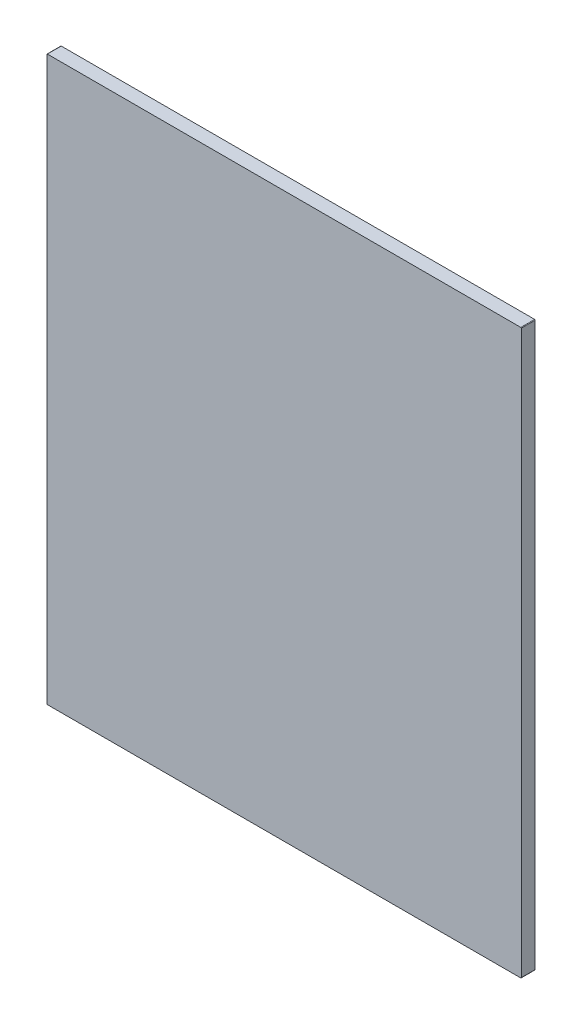
ISO-10303-21;
HEADER;
FILE_DESCRIPTION(('STEP AP214'),'2;1');
FILE_NAME('part.step','',(''),(''),'','','');
FILE_SCHEMA(('AUTOMOTIVE_DESIGN { 1 0 10303 214 1 1 1 1 }'));
ENDSEC;
DATA;
#1=APPLICATION_CONTEXT('core data for automotive mechanical design processes');
#2=APPLICATION_PROTOCOL_DEFINITION('international standard','automotive_design',2000,#1);
#3=PRODUCT_CONTEXT('',#1,'mechanical');
#4=PRODUCT('Part','Part','',(#3));
#5=PRODUCT_RELATED_PRODUCT_CATEGORY('part','',(#4));
#6=PRODUCT_DEFINITION_FORMATION('','',#4);
#7=PRODUCT_DEFINITION_CONTEXT('part definition',#1,'design');
#8=PRODUCT_DEFINITION('design','',#6,#7);
#9=PRODUCT_DEFINITION_SHAPE('','',#8);
#10=(LENGTH_UNIT() NAMED_UNIT(*) SI_UNIT(.MILLI.,.METRE.));
#11=(NAMED_UNIT(*) PLANE_ANGLE_UNIT() SI_UNIT($,.RADIAN.));
#12=(NAMED_UNIT(*) SI_UNIT($,.STERADIAN.) SOLID_ANGLE_UNIT());
#13=UNCERTAINTY_MEASURE_WITH_UNIT(LENGTH_MEASURE(1.E-05),#10,'distance_accuracy_value','');
#14=(GEOMETRIC_REPRESENTATION_CONTEXT(3) GLOBAL_UNCERTAINTY_ASSIGNED_CONTEXT((#13)) GLOBAL_UNIT_ASSIGNED_CONTEXT((#10,
#11,#12)) REPRESENTATION_CONTEXT('',''));
#15=CARTESIAN_POINT('',(0.,0.,0.));
#16=DIRECTION('',(0.,0.,1.));
#17=DIRECTION('',(1.,0.,0.));
#18=AXIS2_PLACEMENT_3D('',#15,#16,#17);
#19=CARTESIAN_POINT('',(0.,0.,6.35));
#20=DIRECTION('',(1.,0.,0.));
#21=DIRECTION('',(0.,0.,-1.));
#22=AXIS2_PLACEMENT_3D('',#19,#20,#21);
#23=PLANE('',#22);
#24=DIRECTION('',(0.,-1.,0.));
#25=VECTOR('',#24,1.);
#26=CARTESIAN_POINT('',(0.,0.,0.));
#27=LINE('',#26,#25);
#28=CARTESIAN_POINT('',(0.,257.683,0.));
#29=VERTEX_POINT('',#28);
#30=CARTESIAN_POINT('',(0.,0.254,0.));
#31=VERTEX_POINT('',#30);
#32=EDGE_CURVE('E144',#29,#31,#27,.T.);
#33=ORIENTED_EDGE('',*,*,#32,.T.);
#34=DIRECTION('',(0.,0.,-1.));
#35=VECTOR('',#34,1.);
#36=CARTESIAN_POINT('',(0.,0.254,6.35));
#37=LINE('',#36,#35);
#38=CARTESIAN_POINT('',(0.,0.254,6.35));
#39=VERTEX_POINT('',#38);
#40=EDGE_CURVE('E178',#31,#39,#37,.F.);
#41=ORIENTED_EDGE('',*,*,#40,.T.);
#42=DIRECTION('',(0.,-1.,0.));
#43=VECTOR('',#42,1.);
#44=CARTESIAN_POINT('',(0.,0.,6.35));
#45=LINE('',#44,#43);
#46=CARTESIAN_POINT('',(0.,257.683,6.35));
#47=VERTEX_POINT('',#46);
#48=EDGE_CURVE('E142',#47,#39,#45,.T.);
#49=ORIENTED_EDGE('',*,*,#48,.F.);
#50=DIRECTION('',(0.,0.,-1.));
#51=VECTOR('',#50,1.);
#52=CARTESIAN_POINT('',(0.,257.683,6.35));
#53=LINE('',#52,#51);
#54=EDGE_CURVE('E174',#47,#29,#53,.T.);
#55=ORIENTED_EDGE('',*,*,#54,.T.);
#56=EDGE_LOOP('',(#33,#41,#49,#55));
#57=FACE_BOUND('',#56,.T.);
#58=ADVANCED_FACE('F42',(#57),#23,.F.);
#59=CARTESIAN_POINT('',(0.,0.,6.35));
#60=DIRECTION('',(0.,1.,0.));
#61=DIRECTION('',(0.,0.,1.));
#62=AXIS2_PLACEMENT_3D('',#59,#60,#61);
#63=PLANE('',#62);
#64=DIRECTION('',(1.,0.,0.));
#65=VECTOR('',#64,1.);
#66=CARTESIAN_POINT('',(0.,0.,0.));
#67=LINE('',#66,#65);
#68=CARTESIAN_POINT('',(0.254,0.,0.));
#69=VERTEX_POINT('',#68);
#70=CARTESIAN_POINT('',(216.916,0.,0.));
#71=VERTEX_POINT('',#70);
#72=EDGE_CURVE('E137',#69,#71,#67,.T.);
#73=ORIENTED_EDGE('',*,*,#72,.T.);
#74=DIRECTION('',(0.,0.,-1.));
#75=VECTOR('',#74,1.);
#76=CARTESIAN_POINT('',(216.916,0.,6.35));
#77=LINE('',#76,#75);
#78=CARTESIAN_POINT('',(216.916,0.,6.35));
#79=VERTEX_POINT('',#78);
#80=EDGE_CURVE('E113',#71,#79,#77,.F.);
#81=ORIENTED_EDGE('',*,*,#80,.T.);
#82=DIRECTION('',(1.,0.,0.));
#83=VECTOR('',#82,1.);
#84=CARTESIAN_POINT('',(0.,0.,6.35));
#85=LINE('',#84,#83);
#86=CARTESIAN_POINT('',(0.254,0.,6.35));
#87=VERTEX_POINT('',#86);
#88=EDGE_CURVE('E198',#87,#79,#85,.T.);
#89=ORIENTED_EDGE('',*,*,#88,.F.);
#90=DIRECTION('',(0.,0.,-1.));
#91=VECTOR('',#90,1.);
#92=CARTESIAN_POINT('',(0.254,0.,6.35));
#93=LINE('',#92,#91);
#94=EDGE_CURVE('E119',#87,#69,#93,.T.);
#95=ORIENTED_EDGE('',*,*,#94,.T.);
#96=EDGE_LOOP('',(#73,#81,#89,#95));
#97=FACE_BOUND('',#96,.T.);
#98=ADVANCED_FACE('F223',(#97),#63,.F.);
#99=CARTESIAN_POINT('',(217.17,0.,6.35));
#100=DIRECTION('',(-1.,0.,0.));
#101=DIRECTION('',(0.,0.,1.));
#102=AXIS2_PLACEMENT_3D('',#99,#100,#101);
#103=PLANE('',#102);
#104=DIRECTION('',(0.,1.,0.));
#105=VECTOR('',#104,1.);
#106=CARTESIAN_POINT('',(217.17,0.,6.35));
#107=LINE('',#106,#105);
#108=CARTESIAN_POINT('',(217.17,0.254,6.35));
#109=VERTEX_POINT('',#108);
#110=CARTESIAN_POINT('',(217.17,257.683,6.35));
#111=VERTEX_POINT('',#110);
#112=EDGE_CURVE('E128',#109,#111,#107,.T.);
#113=ORIENTED_EDGE('',*,*,#112,.F.);
#114=DIRECTION('',(0.,0.,-1.));
#115=VECTOR('',#114,1.);
#116=CARTESIAN_POINT('',(217.17,0.254,6.35));
#117=LINE('',#116,#115);
#118=CARTESIAN_POINT('',(217.17,0.254,0.));
#119=VERTEX_POINT('',#118);
#120=EDGE_CURVE('E112',#109,#119,#117,.T.);
#121=ORIENTED_EDGE('',*,*,#120,.T.);
#122=DIRECTION('',(0.,1.,0.));
#123=VECTOR('',#122,1.);
#124=CARTESIAN_POINT('',(217.17,0.,0.));
#125=LINE('',#124,#123);
#126=CARTESIAN_POINT('',(217.17,257.683,0.));
#127=VERTEX_POINT('',#126);
#128=EDGE_CURVE('E126',#119,#127,#125,.T.);
#129=ORIENTED_EDGE('',*,*,#128,.T.);
#130=DIRECTION('',(0.,0.,-1.));
#131=VECTOR('',#130,1.);
#132=CARTESIAN_POINT('',(217.17,257.683,6.35));
#133=LINE('',#132,#131);
#134=EDGE_CURVE('E131',#127,#111,#133,.F.);
#135=ORIENTED_EDGE('',*,*,#134,.T.);
#136=EDGE_LOOP('',(#113,#121,#129,#135));
#137=FACE_BOUND('',#136,.T.);
#138=ADVANCED_FACE('F125',(#137),#103,.F.);
#139=CARTESIAN_POINT('',(0.,257.937,6.35));
#140=DIRECTION('',(0.,-1.,0.));
#141=DIRECTION('',(0.,0.,-1.));
#142=AXIS2_PLACEMENT_3D('',#139,#140,#141);
#143=PLANE('',#142);
#144=DIRECTION('',(-1.,0.,0.));
#145=VECTOR('',#144,1.);
#146=CARTESIAN_POINT('',(0.,257.937,0.));
#147=LINE('',#146,#145);
#148=CARTESIAN_POINT('',(216.916,257.937,0.));
#149=VERTEX_POINT('',#148);
#150=CARTESIAN_POINT('',(0.254,257.937,0.));
#151=VERTEX_POINT('',#150);
#152=EDGE_CURVE('E136',#149,#151,#147,.T.);
#153=ORIENTED_EDGE('',*,*,#152,.T.);
#154=DIRECTION('',(0.,0.,-1.));
#155=VECTOR('',#154,1.);
#156=CARTESIAN_POINT('',(0.254,257.937,6.35));
#157=LINE('',#156,#155);
#158=CARTESIAN_POINT('',(0.254,257.937,6.35));
#159=VERTEX_POINT('',#158);
#160=EDGE_CURVE('E11',#151,#159,#157,.F.);
#161=ORIENTED_EDGE('',*,*,#160,.T.);
#162=DIRECTION('',(-1.,0.,0.));
#163=VECTOR('',#162,1.);
#164=CARTESIAN_POINT('',(0.,257.937,6.35));
#165=LINE('',#164,#163);
#166=CARTESIAN_POINT('',(216.916,257.937,6.35));
#167=VERTEX_POINT('',#166);
#168=EDGE_CURVE('E149',#167,#159,#165,.T.);
#169=ORIENTED_EDGE('',*,*,#168,.F.);
#170=DIRECTION('',(0.,0.,-1.));
#171=VECTOR('',#170,1.);
#172=CARTESIAN_POINT('',(216.916,257.937,6.35));
#173=LINE('',#172,#171);
#174=EDGE_CURVE('E51',#167,#149,#173,.T.);
#175=ORIENTED_EDGE('',*,*,#174,.T.);
#176=EDGE_LOOP('',(#153,#161,#169,#175));
#177=FACE_BOUND('',#176,.T.);
#178=ADVANCED_FACE('F184',(#177),#143,.F.);
#179=CARTESIAN_POINT('',(0.,0.,6.35));
#180=DIRECTION('',(0.,0.,-1.));
#181=DIRECTION('',(-1.,0.,0.));
#182=AXIS2_PLACEMENT_3D('',#179,#180,#181);
#183=PLANE('',#182);
#184=ORIENTED_EDGE('',*,*,#88,.T.);
#185=CARTESIAN_POINT('',(216.916,0.254,6.35));
#186=DIRECTION('',(0.,0.,-1.));
#187=DIRECTION('',(-1.,0.,0.));
#188=AXIS2_PLACEMENT_3D('',#185,#186,#187);
#189=CIRCLE('',#188,0.254);
#190=EDGE_CURVE('E171',#79,#109,#189,.F.);
#191=ORIENTED_EDGE('',*,*,#190,.T.);
#192=ORIENTED_EDGE('',*,*,#112,.T.);
#193=CARTESIAN_POINT('',(216.916,257.683,6.35));
#194=DIRECTION('',(0.,0.,-1.));
#195=DIRECTION('',(-1.,0.,0.));
#196=AXIS2_PLACEMENT_3D('',#193,#194,#195);
#197=CIRCLE('',#196,0.254);
#198=EDGE_CURVE('E63',#111,#167,#197,.F.);
#199=ORIENTED_EDGE('',*,*,#198,.T.);
#200=ORIENTED_EDGE('',*,*,#168,.T.);
#201=CARTESIAN_POINT('',(0.254,257.683,6.35));
#202=DIRECTION('',(0.,0.,-1.));
#203=DIRECTION('',(-1.,0.,0.));
#204=AXIS2_PLACEMENT_3D('',#201,#202,#203);
#205=CIRCLE('',#204,0.254);
#206=EDGE_CURVE('E165',#159,#47,#205,.F.);
#207=ORIENTED_EDGE('',*,*,#206,.T.);
#208=ORIENTED_EDGE('',*,*,#48,.T.);
#209=CARTESIAN_POINT('',(0.254,0.254,6.35));
#210=DIRECTION('',(0.,0.,-1.));
#211=DIRECTION('',(-1.,0.,0.));
#212=AXIS2_PLACEMENT_3D('',#209,#210,#211);
#213=CIRCLE('',#212,0.254);
#214=EDGE_CURVE('E168',#39,#87,#213,.F.);
#215=ORIENTED_EDGE('',*,*,#214,.T.);
#216=EDGE_LOOP('',(#184,#191,#192,#199,#200,#207,#208,#215));
#217=FACE_BOUND('',#216,.T.);
#218=ADVANCED_FACE('F212',(#217),#183,.F.);
#219=CARTESIAN_POINT('',(0.,0.,0.));
#220=DIRECTION('',(0.,0.,-1.));
#221=DIRECTION('',(-1.,0.,0.));
#222=AXIS2_PLACEMENT_3D('',#219,#220,#221);
#223=PLANE('',#222);
#224=ORIENTED_EDGE('',*,*,#128,.F.);
#225=CARTESIAN_POINT('',(216.916,0.254,0.));
#226=DIRECTION('',(0.,0.,-1.));
#227=DIRECTION('',(-1.,0.,0.));
#228=AXIS2_PLACEMENT_3D('',#225,#226,#227);
#229=CIRCLE('',#228,0.254);
#230=EDGE_CURVE('E108',#119,#71,#229,.T.);
#231=ORIENTED_EDGE('',*,*,#230,.T.);
#232=ORIENTED_EDGE('',*,*,#72,.F.);
#233=CARTESIAN_POINT('',(0.254,0.254,0.));
#234=DIRECTION('',(0.,0.,-1.));
#235=DIRECTION('',(-1.,0.,0.));
#236=AXIS2_PLACEMENT_3D('',#233,#234,#235);
#237=CIRCLE('',#236,0.254);
#238=EDGE_CURVE('E120',#69,#31,#237,.T.);
#239=ORIENTED_EDGE('',*,*,#238,.T.);
#240=ORIENTED_EDGE('',*,*,#32,.F.);
#241=CARTESIAN_POINT('',(0.254,257.683,0.));
#242=DIRECTION('',(0.,0.,-1.));
#243=DIRECTION('',(-1.,0.,0.));
#244=AXIS2_PLACEMENT_3D('',#241,#242,#243);
#245=CIRCLE('',#244,0.254);
#246=EDGE_CURVE('E153',#29,#151,#245,.T.);
#247=ORIENTED_EDGE('',*,*,#246,.T.);
#248=ORIENTED_EDGE('',*,*,#152,.F.);
#249=CARTESIAN_POINT('',(216.916,257.683,0.));
#250=DIRECTION('',(0.,0.,-1.));
#251=DIRECTION('',(-1.,0.,0.));
#252=AXIS2_PLACEMENT_3D('',#249,#250,#251);
#253=CIRCLE('',#252,0.254);
#254=EDGE_CURVE('E130',#149,#127,#253,.T.);
#255=ORIENTED_EDGE('',*,*,#254,.T.);
#256=EDGE_LOOP('',(#224,#231,#232,#239,#240,#247,#248,#255));
#257=FACE_BOUND('',#256,.T.);
#258=ADVANCED_FACE('F133',(#257),#223,.T.);
#259=CARTESIAN_POINT('',(216.916,0.254,6.35));
#260=DIRECTION('',(0.,0.,-1.));
#261=DIRECTION('',(-1.,0.,0.));
#262=AXIS2_PLACEMENT_3D('',#259,#260,#261);
#263=CYLINDRICAL_SURFACE('',#262,0.254);
#264=ORIENTED_EDGE('',*,*,#190,.F.);
#265=ORIENTED_EDGE('',*,*,#80,.F.);
#266=ORIENTED_EDGE('',*,*,#230,.F.);
#267=ORIENTED_EDGE('',*,*,#120,.F.);
#268=EDGE_LOOP('',(#264,#265,#266,#267));
#269=FACE_BOUND('',#268,.T.);
#270=ADVANCED_FACE('F111',(#269),#263,.T.);
#271=CARTESIAN_POINT('',(0.254,0.254,6.35));
#272=DIRECTION('',(0.,0.,-1.));
#273=DIRECTION('',(-1.,0.,0.));
#274=AXIS2_PLACEMENT_3D('',#271,#272,#273);
#275=CYLINDRICAL_SURFACE('',#274,0.254);
#276=ORIENTED_EDGE('',*,*,#214,.F.);
#277=ORIENTED_EDGE('',*,*,#40,.F.);
#278=ORIENTED_EDGE('',*,*,#238,.F.);
#279=ORIENTED_EDGE('',*,*,#94,.F.);
#280=EDGE_LOOP('',(#276,#277,#278,#279));
#281=FACE_BOUND('',#280,.T.);
#282=ADVANCED_FACE('F234',(#281),#275,.T.);
#283=CARTESIAN_POINT('',(0.254,257.683,6.35));
#284=DIRECTION('',(0.,0.,-1.));
#285=DIRECTION('',(-1.,0.,0.));
#286=AXIS2_PLACEMENT_3D('',#283,#284,#285);
#287=CYLINDRICAL_SURFACE('',#286,0.254);
#288=ORIENTED_EDGE('',*,*,#206,.F.);
#289=ORIENTED_EDGE('',*,*,#160,.F.);
#290=ORIENTED_EDGE('',*,*,#246,.F.);
#291=ORIENTED_EDGE('',*,*,#54,.F.);
#292=EDGE_LOOP('',(#288,#289,#290,#291));
#293=FACE_BOUND('',#292,.T.);
#294=ADVANCED_FACE('F191',(#293),#287,.T.);
#295=CARTESIAN_POINT('',(216.916,257.683,6.35));
#296=DIRECTION('',(0.,0.,-1.));
#297=DIRECTION('',(-1.,0.,0.));
#298=AXIS2_PLACEMENT_3D('',#295,#296,#297);
#299=CYLINDRICAL_SURFACE('',#298,0.254);
#300=ORIENTED_EDGE('',*,*,#198,.F.);
#301=ORIENTED_EDGE('',*,*,#134,.F.);
#302=ORIENTED_EDGE('',*,*,#254,.F.);
#303=ORIENTED_EDGE('',*,*,#174,.F.);
#304=EDGE_LOOP('',(#300,#301,#302,#303));
#305=FACE_BOUND('',#304,.T.);
#306=ADVANCED_FACE('F44',(#305),#299,.T.);
#307=CLOSED_SHELL('',(#58,#98,#138,#178,#218,#258,#270,#282,#294,#306));
#308=MANIFOLD_SOLID_BREP('B2',#307);
#309=ADVANCED_BREP_SHAPE_REPRESENTATION('',(#18,#308),#14);
#310=SHAPE_DEFINITION_REPRESENTATION(#9,#309);
ENDSEC;
END-ISO-10303-21;
